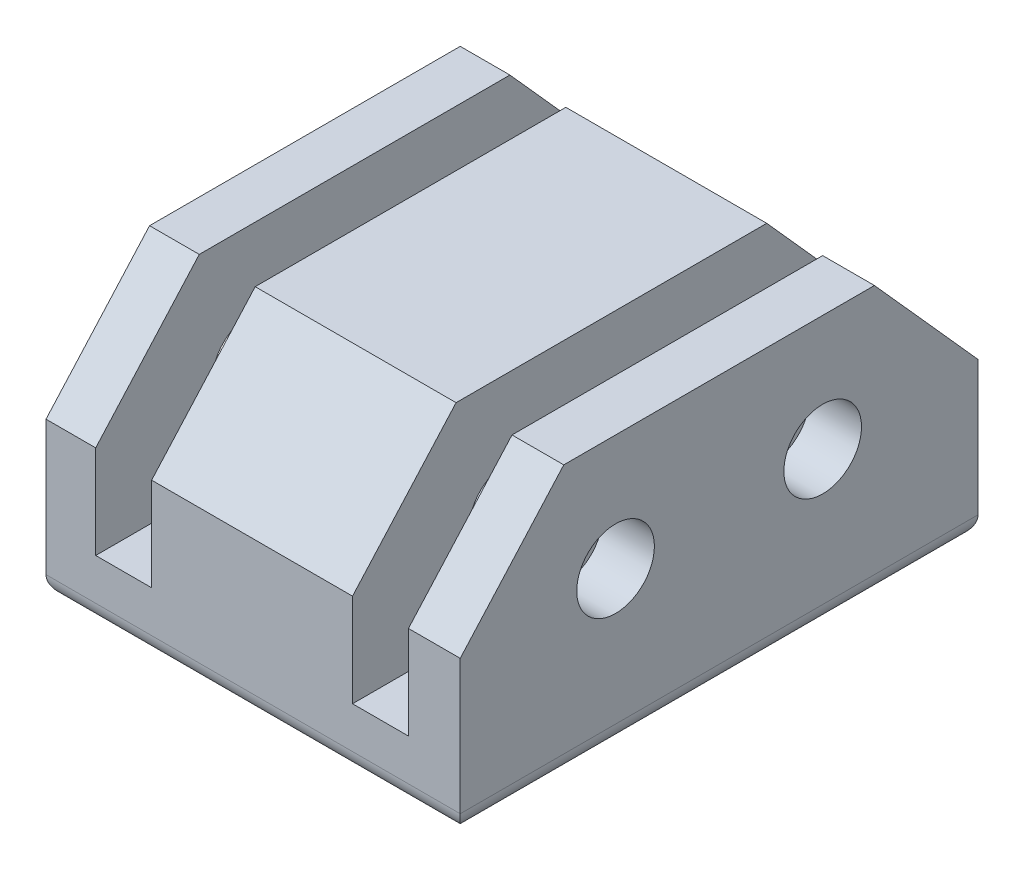
ISO-10303-21;
HEADER;
FILE_DESCRIPTION(('STEP AP214'),'2;1');
FILE_NAME('part.step','',(''),(''),'','','');
FILE_SCHEMA(('AUTOMOTIVE_DESIGN { 1 0 10303 214 1 1 1 1 }'));
ENDSEC;
DATA;
#1=APPLICATION_CONTEXT('core data for automotive mechanical design processes');
#2=APPLICATION_PROTOCOL_DEFINITION('international standard','automotive_design',2000,#1);
#3=PRODUCT_CONTEXT('',#1,'mechanical');
#4=PRODUCT('Part','Part','',(#3));
#5=PRODUCT_RELATED_PRODUCT_CATEGORY('part','',(#4));
#6=PRODUCT_DEFINITION_FORMATION('','',#4);
#7=PRODUCT_DEFINITION_CONTEXT('part definition',#1,'design');
#8=PRODUCT_DEFINITION('design','',#6,#7);
#9=PRODUCT_DEFINITION_SHAPE('','',#8);
#10=(LENGTH_UNIT() NAMED_UNIT(*) SI_UNIT(.MILLI.,.METRE.));
#11=(NAMED_UNIT(*) PLANE_ANGLE_UNIT() SI_UNIT($,.RADIAN.));
#12=(NAMED_UNIT(*) SI_UNIT($,.STERADIAN.) SOLID_ANGLE_UNIT());
#13=UNCERTAINTY_MEASURE_WITH_UNIT(LENGTH_MEASURE(1.E-05),#10,'distance_accuracy_value','');
#14=(GEOMETRIC_REPRESENTATION_CONTEXT(3) GLOBAL_UNCERTAINTY_ASSIGNED_CONTEXT((#13)) GLOBAL_UNIT_ASSIGNED_CONTEXT((#10,
#11,#12)) REPRESENTATION_CONTEXT('',''));
#15=CARTESIAN_POINT('',(0.,0.,0.));
#16=DIRECTION('',(0.,0.,1.));
#17=DIRECTION('',(1.,0.,0.));
#18=AXIS2_PLACEMENT_3D('',#15,#16,#17);
#19=CARTESIAN_POINT('',(-50.8,19.05,0.));
#20=DIRECTION('',(0.,0.666666666666667,0.74535599249993));
#21=DIRECTION('',(0.,-0.74535599249993,0.666666666666667));
#22=AXIS2_PLACEMENT_3D('',#19,#20,#21);
#23=PLANE('',#22);
#24=DIRECTION('',(0.,-0.74535599249993,0.666666666666667));
#25=VECTOR('',#24,1.);
#26=CARTESIAN_POINT('',(-44.704,19.05,0.));
#27=LINE('',#26,#25);
#28=CARTESIAN_POINT('',(-44.704,33.2490316571237,-12.7));
#29=VERTEX_POINT('',#28);
#30=CARTESIAN_POINT('',(-44.704,19.05,0.));
#31=VERTEX_POINT('',#30);
#32=EDGE_CURVE('E222',#29,#31,#27,.T.);
#33=ORIENTED_EDGE('',*,*,#32,.F.);
#34=DIRECTION('',(1.,0.,0.));
#35=VECTOR('',#34,1.);
#36=CARTESIAN_POINT('',(-50.8,33.2490316571237,-12.7));
#37=LINE('',#36,#35);
#38=CARTESIAN_POINT('',(-50.8,33.2490316571237,-12.7));
#39=VERTEX_POINT('',#38);
#40=EDGE_CURVE('E279',#39,#29,#37,.T.);
#41=ORIENTED_EDGE('',*,*,#40,.F.);
#42=DIRECTION('',(0.,-0.74535599249993,0.666666666666667));
#43=VECTOR('',#42,1.);
#44=CARTESIAN_POINT('',(-50.8,19.05,0.));
#45=LINE('',#44,#43);
#46=CARTESIAN_POINT('',(-50.8,19.05,0.));
#47=VERTEX_POINT('',#46);
#48=EDGE_CURVE('E263',#39,#47,#45,.T.);
#49=ORIENTED_EDGE('',*,*,#48,.T.);
#50=DIRECTION('',(1.,0.,0.));
#51=VECTOR('',#50,1.);
#52=CARTESIAN_POINT('',(-50.8,19.05,0.));
#53=LINE('',#52,#51);
#54=EDGE_CURVE('E274',#47,#31,#53,.T.);
#55=ORIENTED_EDGE('',*,*,#54,.T.);
#56=EDGE_LOOP('',(#33,#41,#49,#55));
#57=FACE_BOUND('',#56,.T.);
#58=ADVANCED_FACE('F39',(#57),#23,.T.);
#59=CARTESIAN_POINT('',(-50.8,33.2490316571237,-12.7));
#60=DIRECTION('',(0.,1.,0.));
#61=DIRECTION('',(0.,0.,1.));
#62=AXIS2_PLACEMENT_3D('',#59,#60,#61);
#63=PLANE('',#62);
#64=DIRECTION('',(0.,0.,-1.));
#65=VECTOR('',#64,1.);
#66=CARTESIAN_POINT('',(-44.704,33.2490316571237,0.));
#67=LINE('',#66,#65);
#68=CARTESIAN_POINT('',(-44.704,33.2490316571237,-50.8));
#69=VERTEX_POINT('',#68);
#70=EDGE_CURVE('E196',#29,#69,#67,.T.);
#71=ORIENTED_EDGE('',*,*,#70,.T.);
#72=DIRECTION('',(1.,0.,0.));
#73=VECTOR('',#72,1.);
#74=CARTESIAN_POINT('',(-50.8,33.2490316571237,-50.8));
#75=LINE('',#74,#73);
#76=CARTESIAN_POINT('',(-50.8,33.2490316571237,-50.8));
#77=VERTEX_POINT('',#76);
#78=EDGE_CURVE('E284',#77,#69,#75,.T.);
#79=ORIENTED_EDGE('',*,*,#78,.F.);
#80=DIRECTION('',(0.,0.,1.));
#81=VECTOR('',#80,1.);
#82=CARTESIAN_POINT('',(-50.8,33.2490316571237,-12.7));
#83=LINE('',#82,#81);
#84=EDGE_CURVE('E259',#77,#39,#83,.T.);
#85=ORIENTED_EDGE('',*,*,#84,.T.);
#86=ORIENTED_EDGE('',*,*,#40,.T.);
#87=EDGE_LOOP('',(#71,#79,#85,#86));
#88=FACE_BOUND('',#87,.T.);
#89=ADVANCED_FACE('F396',(#88),#63,.T.);
#90=CARTESIAN_POINT('',(-50.8,33.2490316571237,-50.8));
#91=DIRECTION('',(0.,0.666666666666666,-0.74535599249993));
#92=DIRECTION('',(0.,0.74535599249993,0.666666666666666));
#93=AXIS2_PLACEMENT_3D('',#90,#91,#92);
#94=PLANE('',#93);
#95=DIRECTION('',(0.,0.74535599249993,0.666666666666666));
#96=VECTOR('',#95,1.);
#97=CARTESIAN_POINT('',(-44.704,33.2490316571237,-50.8));
#98=LINE('',#97,#96);
#99=CARTESIAN_POINT('',(-44.704,19.05,-63.5));
#100=VERTEX_POINT('',#99);
#101=EDGE_CURVE('E220',#100,#69,#98,.T.);
#102=ORIENTED_EDGE('',*,*,#101,.F.);
#103=DIRECTION('',(1.,0.,0.));
#104=VECTOR('',#103,1.);
#105=CARTESIAN_POINT('',(-50.8,19.05,-63.5));
#106=LINE('',#105,#104);
#107=CARTESIAN_POINT('',(-50.8,19.05,-63.5));
#108=VERTEX_POINT('',#107);
#109=EDGE_CURVE('E289',#108,#100,#106,.T.);
#110=ORIENTED_EDGE('',*,*,#109,.F.);
#111=DIRECTION('',(0.,0.74535599249993,0.666666666666666));
#112=VECTOR('',#111,1.);
#113=CARTESIAN_POINT('',(-50.8,33.2490316571237,-50.8));
#114=LINE('',#113,#112);
#115=EDGE_CURVE('E256',#108,#77,#114,.T.);
#116=ORIENTED_EDGE('',*,*,#115,.T.);
#117=ORIENTED_EDGE('',*,*,#78,.T.);
#118=EDGE_LOOP('',(#102,#110,#116,#117));
#119=FACE_BOUND('',#118,.T.);
#120=ADVANCED_FACE('F404',(#119),#94,.T.);
#121=DIRECTION('',(0.,0.74535599249993,-0.666666666666667));
#122=VECTOR('',#121,1.);
#123=CARTESIAN_POINT('',(-37.846,19.05,0.));
#124=LINE('',#123,#122);
#125=CARTESIAN_POINT('',(-37.846,19.05,0.));
#126=VERTEX_POINT('',#125);
#127=CARTESIAN_POINT('',(-37.846,33.2490316571237,-12.7));
#128=VERTEX_POINT('',#127);
#129=EDGE_CURVE('E218',#126,#128,#124,.T.);
#130=ORIENTED_EDGE('',*,*,#129,.F.);
#131=CARTESIAN_POINT('',(-13.208,19.05,0.));
#132=VERTEX_POINT('',#131);
#133=EDGE_CURVE('E201',#126,#132,#53,.T.);
#134=ORIENTED_EDGE('',*,*,#133,.T.);
#135=DIRECTION('',(0.,-0.74535599249993,0.666666666666667));
#136=VECTOR('',#135,1.);
#137=CARTESIAN_POINT('',(-13.208,19.05,0.));
#138=LINE('',#137,#136);
#139=CARTESIAN_POINT('',(-13.208,33.2490316571237,-12.7));
#140=VERTEX_POINT('',#139);
#141=EDGE_CURVE('E252',#140,#132,#138,.T.);
#142=ORIENTED_EDGE('',*,*,#141,.F.);
#143=EDGE_CURVE('E282',#128,#140,#37,.T.);
#144=ORIENTED_EDGE('',*,*,#143,.F.);
#145=EDGE_LOOP('',(#130,#134,#142,#144));
#146=FACE_BOUND('',#145,.T.);
#147=ADVANCED_FACE('F399',(#146),#23,.T.);
#148=DIRECTION('',(0.,0.,-1.));
#149=VECTOR('',#148,1.);
#150=CARTESIAN_POINT('',(-37.846,33.2490316571237,0.));
#151=LINE('',#150,#149);
#152=CARTESIAN_POINT('',(-37.846,33.2490316571237,-50.8));
#153=VERTEX_POINT('',#152);
#154=EDGE_CURVE('E188',#128,#153,#151,.T.);
#155=ORIENTED_EDGE('',*,*,#154,.F.);
#156=ORIENTED_EDGE('',*,*,#143,.T.);
#157=DIRECTION('',(0.,0.,-1.));
#158=VECTOR('',#157,1.);
#159=CARTESIAN_POINT('',(-13.208,33.2490316571237,0.));
#160=LINE('',#159,#158);
#161=CARTESIAN_POINT('',(-13.208,33.2490316571237,-50.8));
#162=VERTEX_POINT('',#161);
#163=EDGE_CURVE('E234',#140,#162,#160,.T.);
#164=ORIENTED_EDGE('',*,*,#163,.T.);
#165=EDGE_CURVE('E287',#153,#162,#75,.T.);
#166=ORIENTED_EDGE('',*,*,#165,.F.);
#167=EDGE_LOOP('',(#155,#156,#164,#166));
#168=FACE_BOUND('',#167,.T.);
#169=ADVANCED_FACE('F407',(#168),#63,.T.);
#170=DIRECTION('',(0.,-0.74535599249993,-0.666666666666666));
#171=VECTOR('',#170,1.);
#172=CARTESIAN_POINT('',(-37.846,33.2490316571237,-50.8));
#173=LINE('',#172,#171);
#174=CARTESIAN_POINT('',(-37.846,19.05,-63.5));
#175=VERTEX_POINT('',#174);
#176=EDGE_CURVE('E212',#153,#175,#173,.T.);
#177=ORIENTED_EDGE('',*,*,#176,.F.);
#178=ORIENTED_EDGE('',*,*,#165,.T.);
#179=DIRECTION('',(0.,0.74535599249993,0.666666666666666));
#180=VECTOR('',#179,1.);
#181=CARTESIAN_POINT('',(-13.208,33.2490316571237,-50.8));
#182=LINE('',#181,#180);
#183=CARTESIAN_POINT('',(-13.208,19.05,-63.5));
#184=VERTEX_POINT('',#183);
#185=EDGE_CURVE('E303',#184,#162,#182,.T.);
#186=ORIENTED_EDGE('',*,*,#185,.F.);
#187=EDGE_CURVE('E292',#175,#184,#106,.T.);
#188=ORIENTED_EDGE('',*,*,#187,.F.);
#189=EDGE_LOOP('',(#177,#178,#186,#188));
#190=FACE_BOUND('',#189,.T.);
#191=ADVANCED_FACE('F446',(#190),#94,.T.);
#192=CARTESIAN_POINT('',(-50.8,0.,0.));
#193=DIRECTION('',(0.,0.,1.));
#194=DIRECTION('',(1.,0.,0.));
#195=AXIS2_PLACEMENT_3D('',#192,#193,#194);
#196=PLANE('',#195);
#197=DIRECTION('',(0.,-1.,0.));
#198=VECTOR('',#197,1.);
#199=CARTESIAN_POINT('',(-50.8,0.,0.));
#200=LINE('',#199,#198);
#201=CARTESIAN_POINT('',(-50.8,2.54,0.));
#202=VERTEX_POINT('',#201);
#203=EDGE_CURVE('E293',#47,#202,#200,.T.);
#204=ORIENTED_EDGE('',*,*,#203,.T.);
#205=DIRECTION('',(1.,0.,0.));
#206=VECTOR('',#205,1.);
#207=CARTESIAN_POINT('',(-50.8,2.54,0.));
#208=LINE('',#207,#206);
#209=CARTESIAN_POINT('',(0.,2.54,0.));
#210=VERTEX_POINT('',#209);
#211=EDGE_CURVE('E11',#202,#210,#208,.T.);
#212=ORIENTED_EDGE('',*,*,#211,.T.);
#213=DIRECTION('',(0.,-1.,0.));
#214=VECTOR('',#213,1.);
#215=CARTESIAN_POINT('',(0.,0.,0.));
#216=LINE('',#215,#214);
#217=CARTESIAN_POINT('',(0.,19.05,0.));
#218=VERTEX_POINT('',#217);
#219=EDGE_CURVE('E277',#218,#210,#216,.T.);
#220=ORIENTED_EDGE('',*,*,#219,.F.);
#221=CARTESIAN_POINT('',(-6.35,19.05,0.));
#222=VERTEX_POINT('',#221);
#223=EDGE_CURVE('E278',#222,#218,#53,.T.);
#224=ORIENTED_EDGE('',*,*,#223,.F.);
#225=DIRECTION('',(0.,-1.,0.));
#226=VECTOR('',#225,1.);
#227=CARTESIAN_POINT('',(-6.35,7.62,0.));
#228=LINE('',#227,#226);
#229=CARTESIAN_POINT('',(-6.35,7.62,0.));
#230=VERTEX_POINT('',#229);
#231=EDGE_CURVE('E227',#222,#230,#228,.T.);
#232=ORIENTED_EDGE('',*,*,#231,.T.);
#233=DIRECTION('',(-1.,0.,0.));
#234=VECTOR('',#233,1.);
#235=CARTESIAN_POINT('',(-6.35,7.62,0.));
#236=LINE('',#235,#234);
#237=CARTESIAN_POINT('',(-13.208,7.62,0.));
#238=VERTEX_POINT('',#237);
#239=EDGE_CURVE('E231',#230,#238,#236,.T.);
#240=ORIENTED_EDGE('',*,*,#239,.T.);
#241=DIRECTION('',(0.,1.,0.));
#242=VECTOR('',#241,1.);
#243=CARTESIAN_POINT('',(-13.208,7.62,0.));
#244=LINE('',#243,#242);
#245=EDGE_CURVE('E225',#238,#132,#244,.T.);
#246=ORIENTED_EDGE('',*,*,#245,.T.);
#247=ORIENTED_EDGE('',*,*,#133,.F.);
#248=DIRECTION('',(0.,-1.,0.));
#249=VECTOR('',#248,1.);
#250=CARTESIAN_POINT('',(-37.846,7.62,0.));
#251=LINE('',#250,#249);
#252=CARTESIAN_POINT('',(-37.846,7.62,0.));
#253=VERTEX_POINT('',#252);
#254=EDGE_CURVE('E180',#126,#253,#251,.T.);
#255=ORIENTED_EDGE('',*,*,#254,.T.);
#256=DIRECTION('',(-1.,0.,0.));
#257=VECTOR('',#256,1.);
#258=CARTESIAN_POINT('',(-37.846,7.62,0.));
#259=LINE('',#258,#257);
#260=CARTESIAN_POINT('',(-44.704,7.62,0.));
#261=VERTEX_POINT('',#260);
#262=EDGE_CURVE('E191',#253,#261,#259,.T.);
#263=ORIENTED_EDGE('',*,*,#262,.T.);
#264=DIRECTION('',(0.,1.,0.));
#265=VECTOR('',#264,1.);
#266=CARTESIAN_POINT('',(-44.704,7.62,0.));
#267=LINE('',#266,#265);
#268=EDGE_CURVE('E202',#261,#31,#267,.T.);
#269=ORIENTED_EDGE('',*,*,#268,.T.);
#270=ORIENTED_EDGE('',*,*,#54,.F.);
#271=EDGE_LOOP('',(#204,#212,#220,#224,#232,#240,#246,#247,#255,#263,#269,#270));
#272=FACE_BOUND('',#271,.T.);
#273=ADVANCED_FACE('F199',(#272),#196,.T.);
#274=CARTESIAN_POINT('',(-50.8,0.,-63.5));
#275=DIRECTION('',(0.,0.,-1.));
#276=DIRECTION('',(-1.,0.,0.));
#277=AXIS2_PLACEMENT_3D('',#274,#275,#276);
#278=PLANE('',#277);
#279=DIRECTION('',(0.,1.,0.));
#280=VECTOR('',#279,1.);
#281=CARTESIAN_POINT('',(0.,0.,-63.5));
#282=LINE('',#281,#280);
#283=CARTESIAN_POINT('',(0.,2.54,-63.5));
#284=VERTEX_POINT('',#283);
#285=CARTESIAN_POINT('',(0.,19.05,-63.5));
#286=VERTEX_POINT('',#285);
#287=EDGE_CURVE('E296',#284,#286,#282,.T.);
#288=ORIENTED_EDGE('',*,*,#287,.F.);
#289=DIRECTION('',(1.,0.,0.));
#290=VECTOR('',#289,1.);
#291=CARTESIAN_POINT('',(-50.8,2.54,-63.5));
#292=LINE('',#291,#290);
#293=CARTESIAN_POINT('',(-50.8,2.54,-63.5));
#294=VERTEX_POINT('',#293);
#295=EDGE_CURVE('E63',#284,#294,#292,.F.);
#296=ORIENTED_EDGE('',*,*,#295,.T.);
#297=DIRECTION('',(0.,1.,0.));
#298=VECTOR('',#297,1.);
#299=CARTESIAN_POINT('',(-50.8,0.,-63.5));
#300=LINE('',#299,#298);
#301=EDGE_CURVE('E295',#294,#108,#300,.T.);
#302=ORIENTED_EDGE('',*,*,#301,.T.);
#303=ORIENTED_EDGE('',*,*,#109,.T.);
#304=DIRECTION('',(0.,1.,0.));
#305=VECTOR('',#304,1.);
#306=CARTESIAN_POINT('',(-44.704,7.62,-63.5));
#307=LINE('',#306,#305);
#308=CARTESIAN_POINT('',(-44.704,7.62,-63.5));
#309=VERTEX_POINT('',#308);
#310=EDGE_CURVE('E208',#309,#100,#307,.T.);
#311=ORIENTED_EDGE('',*,*,#310,.F.);
#312=DIRECTION('',(-1.,0.,0.));
#313=VECTOR('',#312,1.);
#314=CARTESIAN_POINT('',(-37.846,7.62,-63.5));
#315=LINE('',#314,#313);
#316=CARTESIAN_POINT('',(-37.846,7.62,-63.5));
#317=VERTEX_POINT('',#316);
#318=EDGE_CURVE('E204',#317,#309,#315,.T.);
#319=ORIENTED_EDGE('',*,*,#318,.F.);
#320=DIRECTION('',(0.,-1.,0.));
#321=VECTOR('',#320,1.);
#322=CARTESIAN_POINT('',(-37.846,0.,-63.5));
#323=LINE('',#322,#321);
#324=EDGE_CURVE('E183',#175,#317,#323,.T.);
#325=ORIENTED_EDGE('',*,*,#324,.F.);
#326=ORIENTED_EDGE('',*,*,#187,.T.);
#327=DIRECTION('',(0.,1.,0.));
#328=VECTOR('',#327,1.);
#329=CARTESIAN_POINT('',(-13.208,7.62,-63.5));
#330=LINE('',#329,#328);
#331=CARTESIAN_POINT('',(-13.208,7.62,-63.5));
#332=VERTEX_POINT('',#331);
#333=EDGE_CURVE('E224',#332,#184,#330,.T.);
#334=ORIENTED_EDGE('',*,*,#333,.F.);
#335=DIRECTION('',(-1.,0.,0.));
#336=VECTOR('',#335,1.);
#337=CARTESIAN_POINT('',(-6.35,7.62,-63.5));
#338=LINE('',#337,#336);
#339=CARTESIAN_POINT('',(-6.35,7.62,-63.5));
#340=VERTEX_POINT('',#339);
#341=EDGE_CURVE('E228',#340,#332,#338,.T.);
#342=ORIENTED_EDGE('',*,*,#341,.F.);
#343=DIRECTION('',(0.,-1.,0.));
#344=VECTOR('',#343,1.);
#345=CARTESIAN_POINT('',(-6.35,7.62,-63.5));
#346=LINE('',#345,#344);
#347=CARTESIAN_POINT('',(-6.35,19.05,-63.5));
#348=VERTEX_POINT('',#347);
#349=EDGE_CURVE('E237',#348,#340,#346,.T.);
#350=ORIENTED_EDGE('',*,*,#349,.F.);
#351=EDGE_CURVE('E266',#348,#286,#106,.T.);
#352=ORIENTED_EDGE('',*,*,#351,.T.);
#353=EDGE_LOOP('',(#288,#296,#302,#303,#311,#319,#325,#326,#334,#342,#350,#352));
#354=FACE_BOUND('',#353,.T.);
#355=ADVANCED_FACE('F460',(#354),#278,.T.);
#356=CARTESIAN_POINT('',(-50.8,0.,0.));
#357=DIRECTION('',(0.,-1.,0.));
#358=DIRECTION('',(0.,0.,-1.));
#359=AXIS2_PLACEMENT_3D('',#356,#357,#358);
#360=PLANE('',#359);
#361=CARTESIAN_POINT('',(-9.52499999999999,0.,-12.7));
#362=DIRECTION('',(0.,-1.,0.));
#363=DIRECTION('',(0.,0.,-1.));
#364=AXIS2_PLACEMENT_3D('',#361,#362,#363);
#365=CIRCLE('',#364,1.778);
#366=CARTESIAN_POINT('',(-9.52499999999999,0.,-14.478));
#367=VERTEX_POINT('',#366);
#368=EDGE_CURVE('E725',#367,#367,#365,.T.);
#369=ORIENTED_EDGE('',*,*,#368,.F.);
#370=EDGE_LOOP('',(#369));
#371=FACE_BOUND('',#370,.T.);
#372=CARTESIAN_POINT('',(-41.275,0.,-12.7));
#373=DIRECTION('',(0.,-1.,0.));
#374=DIRECTION('',(0.,0.,-1.));
#375=AXIS2_PLACEMENT_3D('',#372,#373,#374);
#376=CIRCLE('',#375,1.778);
#377=CARTESIAN_POINT('',(-41.275,0.,-14.478));
#378=VERTEX_POINT('',#377);
#379=EDGE_CURVE('E727',#378,#378,#376,.T.);
#380=ORIENTED_EDGE('',*,*,#379,.F.);
#381=EDGE_LOOP('',(#380));
#382=FACE_BOUND('',#381,.T.);
#383=CARTESIAN_POINT('',(-41.275,0.,-50.8));
#384=DIRECTION('',(0.,-1.,0.));
#385=DIRECTION('',(0.,0.,-1.));
#386=AXIS2_PLACEMENT_3D('',#383,#384,#385);
#387=CIRCLE('',#386,1.778);
#388=CARTESIAN_POINT('',(-41.275,0.,-52.578));
#389=VERTEX_POINT('',#388);
#390=EDGE_CURVE('E763',#389,#389,#387,.T.);
#391=ORIENTED_EDGE('',*,*,#390,.F.);
#392=EDGE_LOOP('',(#391));
#393=FACE_BOUND('',#392,.T.);
#394=CARTESIAN_POINT('',(-9.52499999999999,0.,-50.8));
#395=DIRECTION('',(0.,-1.,0.));
#396=DIRECTION('',(0.,0.,-1.));
#397=AXIS2_PLACEMENT_3D('',#394,#395,#396);
#398=CIRCLE('',#397,1.778);
#399=CARTESIAN_POINT('',(-9.52499999999999,0.,-52.578));
#400=VERTEX_POINT('',#399);
#401=EDGE_CURVE('E733',#400,#400,#398,.T.);
#402=ORIENTED_EDGE('',*,*,#401,.F.);
#403=EDGE_LOOP('',(#402));
#404=FACE_BOUND('',#403,.T.);
#405=DIRECTION('',(1.,0.,0.));
#406=VECTOR('',#405,1.);
#407=CARTESIAN_POINT('',(-50.8,0.,-60.96));
#408=LINE('',#407,#406);
#409=CARTESIAN_POINT('',(-48.26,0.,-60.96));
#410=VERTEX_POINT('',#409);
#411=CARTESIAN_POINT('',(-2.54,0.,-60.96));
#412=VERTEX_POINT('',#411);
#413=EDGE_CURVE('E324',#410,#412,#408,.T.);
#414=ORIENTED_EDGE('',*,*,#413,.T.);
#415=DIRECTION('',(0.,0.,-1.));
#416=VECTOR('',#415,1.);
#417=CARTESIAN_POINT('',(-2.54,0.,0.));
#418=LINE('',#417,#416);
#419=CARTESIAN_POINT('',(-2.54,0.,-2.54));
#420=VERTEX_POINT('',#419);
#421=EDGE_CURVE('E326',#412,#420,#418,.F.);
#422=ORIENTED_EDGE('',*,*,#421,.T.);
#423=DIRECTION('',(1.,0.,0.));
#424=VECTOR('',#423,1.);
#425=CARTESIAN_POINT('',(-50.8,0.,-2.54));
#426=LINE('',#425,#424);
#427=CARTESIAN_POINT('',(-48.26,0.,-2.54));
#428=VERTEX_POINT('',#427);
#429=EDGE_CURVE('E320',#420,#428,#426,.F.);
#430=ORIENTED_EDGE('',*,*,#429,.T.);
#431=DIRECTION('',(0.,0.,-1.));
#432=VECTOR('',#431,1.);
#433=CARTESIAN_POINT('',(-48.26,0.,0.));
#434=LINE('',#433,#432);
#435=EDGE_CURVE('E322',#428,#410,#434,.T.);
#436=ORIENTED_EDGE('',*,*,#435,.T.);
#437=EDGE_LOOP('',(#414,#422,#430,#436));
#438=FACE_BOUND('',#437,.T.);
#439=ADVANCED_FACE('F491',(#371,#382,#393,#404,#438),#360,.T.);
#440=CARTESIAN_POINT('',(-50.8,0.,0.));
#441=DIRECTION('',(-1.,0.,0.));
#442=DIRECTION('',(0.,0.,1.));
#443=AXIS2_PLACEMENT_3D('',#440,#441,#442);
#444=PLANE('',#443);
#445=CARTESIAN_POINT('',(-50.8,19.05,-19.05));
#446=DIRECTION('',(1.,0.,0.));
#447=DIRECTION('',(0.,0.,-1.));
#448=AXIS2_PLACEMENT_3D('',#445,#446,#447);
#449=CIRCLE('',#448,4.7625);
#450=CARTESIAN_POINT('',(-50.8,19.05,-23.8125));
#451=VERTEX_POINT('',#450);
#452=EDGE_CURVE('E312',#451,#451,#449,.T.);
#453=ORIENTED_EDGE('',*,*,#452,.T.);
#454=EDGE_LOOP('',(#453));
#455=FACE_BOUND('',#454,.T.);
#456=CARTESIAN_POINT('',(-50.8,19.05,-44.45));
#457=DIRECTION('',(1.,0.,0.));
#458=DIRECTION('',(0.,0.,-1.));
#459=AXIS2_PLACEMENT_3D('',#456,#457,#458);
#460=CIRCLE('',#459,4.7625);
#461=CARTESIAN_POINT('',(-50.8,19.05,-49.2125));
#462=VERTEX_POINT('',#461);
#463=EDGE_CURVE('E347',#462,#462,#460,.T.);
#464=ORIENTED_EDGE('',*,*,#463,.T.);
#465=EDGE_LOOP('',(#464));
#466=FACE_BOUND('',#465,.T.);
#467=ORIENTED_EDGE('',*,*,#301,.F.);
#468=DIRECTION('',(0.,0.,-1.));
#469=VECTOR('',#468,1.);
#470=CARTESIAN_POINT('',(-50.8,2.54,0.));
#471=LINE('',#470,#469);
#472=EDGE_CURVE('E48',#294,#202,#471,.F.);
#473=ORIENTED_EDGE('',*,*,#472,.T.);
#474=ORIENTED_EDGE('',*,*,#203,.F.);
#475=ORIENTED_EDGE('',*,*,#48,.F.);
#476=ORIENTED_EDGE('',*,*,#84,.F.);
#477=ORIENTED_EDGE('',*,*,#115,.F.);
#478=EDGE_LOOP('',(#467,#473,#474,#475,#476,#477));
#479=FACE_BOUND('',#478,.T.);
#480=ADVANCED_FACE('F422',(#455,#466,#479),#444,.T.);
#481=CARTESIAN_POINT('',(0.,0.,0.));
#482=DIRECTION('',(-1.,0.,0.));
#483=DIRECTION('',(0.,0.,1.));
#484=AXIS2_PLACEMENT_3D('',#481,#482,#483);
#485=PLANE('',#484);
#486=CARTESIAN_POINT('',(0.,19.05,-19.05));
#487=DIRECTION('',(1.,0.,0.));
#488=DIRECTION('',(0.,0.,-1.));
#489=AXIS2_PLACEMENT_3D('',#486,#487,#488);
#490=CIRCLE('',#489,4.7625);
#491=CARTESIAN_POINT('',(0.,19.05,-23.8125));
#492=VERTEX_POINT('',#491);
#493=EDGE_CURVE('E352',#492,#492,#490,.T.);
#494=ORIENTED_EDGE('',*,*,#493,.F.);
#495=EDGE_LOOP('',(#494));
#496=FACE_BOUND('',#495,.T.);
#497=CARTESIAN_POINT('',(0.,19.05,-44.45));
#498=DIRECTION('',(1.,0.,0.));
#499=DIRECTION('',(0.,0.,-1.));
#500=AXIS2_PLACEMENT_3D('',#497,#498,#499);
#501=CIRCLE('',#500,4.7625);
#502=CARTESIAN_POINT('',(0.,19.05,-49.2125));
#503=VERTEX_POINT('',#502);
#504=EDGE_CURVE('E341',#503,#503,#501,.T.);
#505=ORIENTED_EDGE('',*,*,#504,.F.);
#506=EDGE_LOOP('',(#505));
#507=FACE_BOUND('',#506,.T.);
#508=ORIENTED_EDGE('',*,*,#219,.T.);
#509=DIRECTION('',(0.,0.,-1.));
#510=VECTOR('',#509,1.);
#511=CARTESIAN_POINT('',(0.,2.54,-63.5));
#512=LINE('',#511,#510);
#513=EDGE_CURVE('E307',#210,#284,#512,.T.);
#514=ORIENTED_EDGE('',*,*,#513,.T.);
#515=ORIENTED_EDGE('',*,*,#287,.T.);
#516=DIRECTION('',(0.,0.74535599249993,0.666666666666666));
#517=VECTOR('',#516,1.);
#518=CARTESIAN_POINT('',(0.,33.2490316571237,-50.8));
#519=LINE('',#518,#517);
#520=CARTESIAN_POINT('',(0.,33.2490316571237,-50.8));
#521=VERTEX_POINT('',#520);
#522=EDGE_CURVE('E255',#286,#521,#519,.T.);
#523=ORIENTED_EDGE('',*,*,#522,.T.);
#524=DIRECTION('',(0.,0.,1.));
#525=VECTOR('',#524,1.);
#526=CARTESIAN_POINT('',(0.,33.2490316571237,-12.7));
#527=LINE('',#526,#525);
#528=CARTESIAN_POINT('',(0.,33.2490316571237,-12.7));
#529=VERTEX_POINT('',#528);
#530=EDGE_CURVE('E269',#521,#529,#527,.T.);
#531=ORIENTED_EDGE('',*,*,#530,.T.);
#532=DIRECTION('',(0.,-0.74535599249993,0.666666666666667));
#533=VECTOR('',#532,1.);
#534=CARTESIAN_POINT('',(0.,19.05,0.));
#535=LINE('',#534,#533);
#536=EDGE_CURVE('E260',#529,#218,#535,.T.);
#537=ORIENTED_EDGE('',*,*,#536,.T.);
#538=EDGE_LOOP('',(#508,#514,#515,#523,#531,#537));
#539=FACE_BOUND('',#538,.T.);
#540=ADVANCED_FACE('F414',(#496,#507,#539),#485,.F.);
#541=DIRECTION('',(0.,0.74535599249993,-0.666666666666667));
#542=VECTOR('',#541,1.);
#543=CARTESIAN_POINT('',(-6.35,19.05,0.));
#544=LINE('',#543,#542);
#545=CARTESIAN_POINT('',(-6.35,33.2490316571237,-12.7));
#546=VERTEX_POINT('',#545);
#547=EDGE_CURVE('E243',#222,#546,#544,.T.);
#548=ORIENTED_EDGE('',*,*,#547,.F.);
#549=ORIENTED_EDGE('',*,*,#223,.T.);
#550=ORIENTED_EDGE('',*,*,#536,.F.);
#551=EDGE_CURVE('E283',#546,#529,#37,.T.);
#552=ORIENTED_EDGE('',*,*,#551,.F.);
#553=EDGE_LOOP('',(#548,#549,#550,#552));
#554=FACE_BOUND('',#553,.T.);
#555=ADVANCED_FACE('F400',(#554),#23,.T.);
#556=DIRECTION('',(0.,0.,-1.));
#557=VECTOR('',#556,1.);
#558=CARTESIAN_POINT('',(-6.35,33.2490316571237,0.));
#559=LINE('',#558,#557);
#560=CARTESIAN_POINT('',(-6.35,33.2490316571237,-50.8));
#561=VERTEX_POINT('',#560);
#562=EDGE_CURVE('E247',#546,#561,#559,.T.);
#563=ORIENTED_EDGE('',*,*,#562,.F.);
#564=ORIENTED_EDGE('',*,*,#551,.T.);
#565=ORIENTED_EDGE('',*,*,#530,.F.);
#566=EDGE_CURVE('E288',#561,#521,#75,.T.);
#567=ORIENTED_EDGE('',*,*,#566,.F.);
#568=EDGE_LOOP('',(#563,#564,#565,#567));
#569=FACE_BOUND('',#568,.T.);
#570=ADVANCED_FACE('F408',(#569),#63,.T.);
#571=DIRECTION('',(0.,-0.74535599249993,-0.666666666666666));
#572=VECTOR('',#571,1.);
#573=CARTESIAN_POINT('',(-6.35,33.2490316571237,-50.8));
#574=LINE('',#573,#572);
#575=EDGE_CURVE('E298',#561,#348,#574,.T.);
#576=ORIENTED_EDGE('',*,*,#575,.F.);
#577=ORIENTED_EDGE('',*,*,#566,.T.);
#578=ORIENTED_EDGE('',*,*,#522,.F.);
#579=ORIENTED_EDGE('',*,*,#351,.F.);
#580=EDGE_LOOP('',(#576,#577,#578,#579));
#581=FACE_BOUND('',#580,.T.);
#582=ADVANCED_FACE('F420',(#581),#94,.T.);
#583=CARTESIAN_POINT('',(-13.208,7.62,0.));
#584=DIRECTION('',(-1.,0.,0.));
#585=DIRECTION('',(0.,-1.,0.));
#586=AXIS2_PLACEMENT_3D('',#583,#584,#585);
#587=PLANE('',#586);
#588=CARTESIAN_POINT('',(-13.208,19.05,-19.05));
#589=DIRECTION('',(-1.,0.,0.));
#590=DIRECTION('',(0.,-1.,0.));
#591=AXIS2_PLACEMENT_3D('',#588,#589,#590);
#592=CIRCLE('',#591,4.7625);
#593=CARTESIAN_POINT('',(-13.208,14.2875,-19.05));
#594=VERTEX_POINT('',#593);
#595=EDGE_CURVE('E210',#594,#594,#592,.T.);
#596=ORIENTED_EDGE('',*,*,#595,.T.);
#597=EDGE_LOOP('',(#596));
#598=FACE_BOUND('',#597,.T.);
#599=CARTESIAN_POINT('',(-13.208,19.05,-44.45));
#600=DIRECTION('',(-1.,0.,0.));
#601=DIRECTION('',(0.,-1.,0.));
#602=AXIS2_PLACEMENT_3D('',#599,#600,#601);
#603=CIRCLE('',#602,4.7625);
#604=CARTESIAN_POINT('',(-13.208,14.2875,-44.45));
#605=VERTEX_POINT('',#604);
#606=EDGE_CURVE('E317',#605,#605,#603,.T.);
#607=ORIENTED_EDGE('',*,*,#606,.T.);
#608=EDGE_LOOP('',(#607));
#609=FACE_BOUND('',#608,.T.);
#610=ORIENTED_EDGE('',*,*,#141,.T.);
#611=ORIENTED_EDGE('',*,*,#245,.F.);
#612=DIRECTION('',(0.,0.,-1.));
#613=VECTOR('',#612,1.);
#614=CARTESIAN_POINT('',(-13.208,7.62,0.));
#615=LINE('',#614,#613);
#616=EDGE_CURVE('E241',#238,#332,#615,.T.);
#617=ORIENTED_EDGE('',*,*,#616,.T.);
#618=ORIENTED_EDGE('',*,*,#333,.T.);
#619=ORIENTED_EDGE('',*,*,#185,.T.);
#620=ORIENTED_EDGE('',*,*,#163,.F.);
#621=EDGE_LOOP('',(#610,#611,#617,#618,#619,#620));
#622=FACE_BOUND('',#621,.T.);
#623=ADVANCED_FACE('F370',(#598,#609,#622),#587,.F.);
#624=CARTESIAN_POINT('',(-6.35,7.62,0.));
#625=DIRECTION('',(0.,-1.,0.));
#626=DIRECTION('',(0.,0.,-1.));
#627=AXIS2_PLACEMENT_3D('',#624,#625,#626);
#628=PLANE('',#627);
#629=CARTESIAN_POINT('',(-9.52499999999999,7.62,-12.7));
#630=DIRECTION('',(0.,-1.,0.));
#631=DIRECTION('',(0.,0.,-1.));
#632=AXIS2_PLACEMENT_3D('',#629,#630,#631);
#633=CIRCLE('',#632,1.778);
#634=CARTESIAN_POINT('',(-9.52499999999999,7.62,-14.478));
#635=VERTEX_POINT('',#634);
#636=EDGE_CURVE('E722',#635,#635,#633,.F.);
#637=ORIENTED_EDGE('',*,*,#636,.F.);
#638=EDGE_LOOP('',(#637));
#639=FACE_BOUND('',#638,.T.);
#640=CARTESIAN_POINT('',(-9.52499999999999,7.62,-50.8));
#641=DIRECTION('',(0.,-1.,0.));
#642=DIRECTION('',(0.,0.,-1.));
#643=AXIS2_PLACEMENT_3D('',#640,#641,#642);
#644=CIRCLE('',#643,1.778);
#645=CARTESIAN_POINT('',(-9.52499999999999,7.62,-52.578));
#646=VERTEX_POINT('',#645);
#647=EDGE_CURVE('E334',#646,#646,#644,.F.);
#648=ORIENTED_EDGE('',*,*,#647,.F.);
#649=EDGE_LOOP('',(#648));
#650=FACE_BOUND('',#649,.T.);
#651=ORIENTED_EDGE('',*,*,#341,.T.);
#652=ORIENTED_EDGE('',*,*,#616,.F.);
#653=ORIENTED_EDGE('',*,*,#239,.F.);
#654=DIRECTION('',(0.,0.,-1.));
#655=VECTOR('',#654,1.);
#656=CARTESIAN_POINT('',(-6.35,7.62,0.));
#657=LINE('',#656,#655);
#658=EDGE_CURVE('E244',#230,#340,#657,.T.);
#659=ORIENTED_EDGE('',*,*,#658,.T.);
#660=EDGE_LOOP('',(#651,#652,#653,#659));
#661=FACE_BOUND('',#660,.T.);
#662=ADVANCED_FACE('F439',(#639,#650,#661),#628,.F.);
#663=CARTESIAN_POINT('',(-6.35,7.62,0.));
#664=DIRECTION('',(1.,0.,0.));
#665=DIRECTION('',(0.,0.,-1.));
#666=AXIS2_PLACEMENT_3D('',#663,#664,#665);
#667=PLANE('',#666);
#668=CARTESIAN_POINT('',(-6.35,19.05,-19.05));
#669=DIRECTION('',(1.,0.,0.));
#670=DIRECTION('',(0.,0.,-1.));
#671=AXIS2_PLACEMENT_3D('',#668,#669,#670);
#672=CIRCLE('',#671,4.7625);
#673=CARTESIAN_POINT('',(-6.35,19.05,-23.8125));
#674=VERTEX_POINT('',#673);
#675=EDGE_CURVE('E365',#674,#674,#672,.T.);
#676=ORIENTED_EDGE('',*,*,#675,.T.);
#677=EDGE_LOOP('',(#676));
#678=FACE_BOUND('',#677,.T.);
#679=CARTESIAN_POINT('',(-6.35,19.05,-44.45));
#680=DIRECTION('',(1.,0.,0.));
#681=DIRECTION('',(0.,0.,-1.));
#682=AXIS2_PLACEMENT_3D('',#679,#680,#681);
#683=CIRCLE('',#682,4.7625);
#684=CARTESIAN_POINT('',(-6.35,19.05,-49.2125));
#685=VERTEX_POINT('',#684);
#686=EDGE_CURVE('E358',#685,#685,#683,.T.);
#687=ORIENTED_EDGE('',*,*,#686,.T.);
#688=EDGE_LOOP('',(#687));
#689=FACE_BOUND('',#688,.T.);
#690=ORIENTED_EDGE('',*,*,#547,.T.);
#691=ORIENTED_EDGE('',*,*,#562,.T.);
#692=ORIENTED_EDGE('',*,*,#575,.T.);
#693=ORIENTED_EDGE('',*,*,#349,.T.);
#694=ORIENTED_EDGE('',*,*,#658,.F.);
#695=ORIENTED_EDGE('',*,*,#231,.F.);
#696=EDGE_LOOP('',(#690,#691,#692,#693,#694,#695));
#697=FACE_BOUND('',#696,.T.);
#698=ADVANCED_FACE('F634',(#678,#689,#697),#667,.F.);
#699=CARTESIAN_POINT('',(-44.704,7.62,0.));
#700=DIRECTION('',(-1.,0.,0.));
#701=DIRECTION('',(0.,-1.,0.));
#702=AXIS2_PLACEMENT_3D('',#699,#700,#701);
#703=PLANE('',#702);
#704=CARTESIAN_POINT('',(-44.704,19.05,-19.05));
#705=DIRECTION('',(-1.,0.,0.));
#706=DIRECTION('',(0.,-1.,0.));
#707=AXIS2_PLACEMENT_3D('',#704,#705,#706);
#708=CIRCLE('',#707,4.7625);
#709=CARTESIAN_POINT('',(-44.704,14.2875,-19.05));
#710=VERTEX_POINT('',#709);
#711=EDGE_CURVE('E316',#710,#710,#708,.T.);
#712=ORIENTED_EDGE('',*,*,#711,.T.);
#713=EDGE_LOOP('',(#712));
#714=FACE_BOUND('',#713,.T.);
#715=CARTESIAN_POINT('',(-44.704,19.05,-44.45));
#716=DIRECTION('',(-1.,0.,0.));
#717=DIRECTION('',(0.,-1.,0.));
#718=AXIS2_PLACEMENT_3D('',#715,#716,#717);
#719=CIRCLE('',#718,4.7625);
#720=CARTESIAN_POINT('',(-44.704,14.2875,-44.45));
#721=VERTEX_POINT('',#720);
#722=EDGE_CURVE('E311',#721,#721,#719,.T.);
#723=ORIENTED_EDGE('',*,*,#722,.T.);
#724=EDGE_LOOP('',(#723));
#725=FACE_BOUND('',#724,.T.);
#726=ORIENTED_EDGE('',*,*,#32,.T.);
#727=ORIENTED_EDGE('',*,*,#268,.F.);
#728=DIRECTION('',(0.,0.,-1.));
#729=VECTOR('',#728,1.);
#730=CARTESIAN_POINT('',(-44.704,7.62,0.));
#731=LINE('',#730,#729);
#732=EDGE_CURVE('E187',#261,#309,#731,.T.);
#733=ORIENTED_EDGE('',*,*,#732,.T.);
#734=ORIENTED_EDGE('',*,*,#310,.T.);
#735=ORIENTED_EDGE('',*,*,#101,.T.);
#736=ORIENTED_EDGE('',*,*,#70,.F.);
#737=EDGE_LOOP('',(#726,#727,#733,#734,#735,#736));
#738=FACE_BOUND('',#737,.T.);
#739=ADVANCED_FACE('F465',(#714,#725,#738),#703,.F.);
#740=CARTESIAN_POINT('',(-37.846,7.62,0.));
#741=DIRECTION('',(0.,-1.,0.));
#742=DIRECTION('',(0.,0.,-1.));
#743=AXIS2_PLACEMENT_3D('',#740,#741,#742);
#744=PLANE('',#743);
#745=CARTESIAN_POINT('',(-41.275,7.62,-12.7));
#746=DIRECTION('',(0.,-1.,0.));
#747=DIRECTION('',(0.,0.,-1.));
#748=AXIS2_PLACEMENT_3D('',#745,#746,#747);
#749=CIRCLE('',#748,1.778);
#750=CARTESIAN_POINT('',(-41.275,7.62,-14.478));
#751=VERTEX_POINT('',#750);
#752=EDGE_CURVE('E730',#751,#751,#749,.F.);
#753=ORIENTED_EDGE('',*,*,#752,.F.);
#754=EDGE_LOOP('',(#753));
#755=FACE_BOUND('',#754,.T.);
#756=CARTESIAN_POINT('',(-41.275,7.62,-50.8));
#757=DIRECTION('',(0.,-1.,0.));
#758=DIRECTION('',(0.,0.,-1.));
#759=AXIS2_PLACEMENT_3D('',#756,#757,#758);
#760=CIRCLE('',#759,1.778);
#761=CARTESIAN_POINT('',(-41.275,7.62,-52.578));
#762=VERTEX_POINT('',#761);
#763=EDGE_CURVE('E736',#762,#762,#760,.F.);
#764=ORIENTED_EDGE('',*,*,#763,.F.);
#765=EDGE_LOOP('',(#764));
#766=FACE_BOUND('',#765,.T.);
#767=ORIENTED_EDGE('',*,*,#318,.T.);
#768=ORIENTED_EDGE('',*,*,#732,.F.);
#769=ORIENTED_EDGE('',*,*,#262,.F.);
#770=DIRECTION('',(0.,0.,-1.));
#771=VECTOR('',#770,1.);
#772=CARTESIAN_POINT('',(-37.846,7.62,0.));
#773=LINE('',#772,#771);
#774=EDGE_CURVE('E176',#253,#317,#773,.T.);
#775=ORIENTED_EDGE('',*,*,#774,.T.);
#776=EDGE_LOOP('',(#767,#768,#769,#775));
#777=FACE_BOUND('',#776,.T.);
#778=ADVANCED_FACE('F192',(#755,#766,#777),#744,.F.);
#779=CARTESIAN_POINT('',(-37.846,7.62,0.));
#780=DIRECTION('',(1.,0.,0.));
#781=DIRECTION('',(0.,0.,-1.));
#782=AXIS2_PLACEMENT_3D('',#779,#780,#781);
#783=PLANE('',#782);
#784=CARTESIAN_POINT('',(-37.846,19.05,-19.05));
#785=DIRECTION('',(1.,0.,0.));
#786=DIRECTION('',(0.,0.,-1.));
#787=AXIS2_PLACEMENT_3D('',#784,#785,#786);
#788=CIRCLE('',#787,4.7625);
#789=CARTESIAN_POINT('',(-37.846,19.05,-23.8125));
#790=VERTEX_POINT('',#789);
#791=EDGE_CURVE('E313',#790,#790,#788,.T.);
#792=ORIENTED_EDGE('',*,*,#791,.T.);
#793=EDGE_LOOP('',(#792));
#794=FACE_BOUND('',#793,.T.);
#795=CARTESIAN_POINT('',(-37.846,19.05,-44.45));
#796=DIRECTION('',(1.,0.,0.));
#797=DIRECTION('',(0.,0.,-1.));
#798=AXIS2_PLACEMENT_3D('',#795,#796,#797);
#799=CIRCLE('',#798,4.7625);
#800=CARTESIAN_POINT('',(-37.846,19.05,-49.2125));
#801=VERTEX_POINT('',#800);
#802=EDGE_CURVE('E308',#801,#801,#799,.T.);
#803=ORIENTED_EDGE('',*,*,#802,.T.);
#804=EDGE_LOOP('',(#803));
#805=FACE_BOUND('',#804,.T.);
#806=ORIENTED_EDGE('',*,*,#129,.T.);
#807=ORIENTED_EDGE('',*,*,#154,.T.);
#808=ORIENTED_EDGE('',*,*,#176,.T.);
#809=ORIENTED_EDGE('',*,*,#324,.T.);
#810=ORIENTED_EDGE('',*,*,#774,.F.);
#811=ORIENTED_EDGE('',*,*,#254,.F.);
#812=EDGE_LOOP('',(#806,#807,#808,#809,#810,#811));
#813=FACE_BOUND('',#812,.T.);
#814=ADVANCED_FACE('F178',(#794,#805,#813),#783,.F.);
#815=CARTESIAN_POINT('',(-50.8,19.05,-44.45));
#816=DIRECTION('',(1.,0.,0.));
#817=DIRECTION('',(0.,0.,-1.));
#818=AXIS2_PLACEMENT_3D('',#815,#816,#817);
#819=CYLINDRICAL_SURFACE('',#818,4.7625);
#820=ORIENTED_EDGE('',*,*,#802,.F.);
#821=EDGE_LOOP('',(#820));
#822=FACE_BOUND('',#821,.T.);
#823=ORIENTED_EDGE('',*,*,#606,.F.);
#824=EDGE_LOOP('',(#823));
#825=FACE_BOUND('',#824,.T.);
#826=ADVANCED_FACE('F376',(#822,#825),#819,.F.);
#827=CARTESIAN_POINT('',(-50.8,19.05,-19.05));
#828=DIRECTION('',(1.,0.,0.));
#829=DIRECTION('',(0.,0.,-1.));
#830=AXIS2_PLACEMENT_3D('',#827,#828,#829);
#831=CYLINDRICAL_SURFACE('',#830,4.7625);
#832=ORIENTED_EDGE('',*,*,#791,.F.);
#833=EDGE_LOOP('',(#832));
#834=FACE_BOUND('',#833,.T.);
#835=ORIENTED_EDGE('',*,*,#595,.F.);
#836=EDGE_LOOP('',(#835));
#837=FACE_BOUND('',#836,.T.);
#838=ADVANCED_FACE('F373',(#834,#837),#831,.F.);
#839=ORIENTED_EDGE('',*,*,#463,.F.);
#840=EDGE_LOOP('',(#839));
#841=FACE_BOUND('',#840,.T.);
#842=ORIENTED_EDGE('',*,*,#722,.F.);
#843=EDGE_LOOP('',(#842));
#844=FACE_BOUND('',#843,.T.);
#845=ADVANCED_FACE('F375',(#841,#844),#819,.F.);
#846=ORIENTED_EDGE('',*,*,#452,.F.);
#847=EDGE_LOOP('',(#846));
#848=FACE_BOUND('',#847,.T.);
#849=ORIENTED_EDGE('',*,*,#711,.F.);
#850=EDGE_LOOP('',(#849));
#851=FACE_BOUND('',#850,.T.);
#852=ADVANCED_FACE('F380',(#848,#851),#831,.F.);
#853=ORIENTED_EDGE('',*,*,#504,.T.);
#854=EDGE_LOOP('',(#853));
#855=FACE_BOUND('',#854,.T.);
#856=ORIENTED_EDGE('',*,*,#686,.F.);
#857=EDGE_LOOP('',(#856));
#858=FACE_BOUND('',#857,.T.);
#859=ADVANCED_FACE('F387',(#855,#858),#819,.F.);
#860=ORIENTED_EDGE('',*,*,#493,.T.);
#861=EDGE_LOOP('',(#860));
#862=FACE_BOUND('',#861,.T.);
#863=ORIENTED_EDGE('',*,*,#675,.F.);
#864=EDGE_LOOP('',(#863));
#865=FACE_BOUND('',#864,.T.);
#866=ADVANCED_FACE('F379',(#862,#865),#831,.F.);
#867=CARTESIAN_POINT('',(-48.26,2.54,0.));
#868=DIRECTION('',(0.,0.,-1.));
#869=DIRECTION('',(-1.,0.,0.));
#870=AXIS2_PLACEMENT_3D('',#867,#868,#869);
#871=CYLINDRICAL_SURFACE('',#870,2.54);
#872=CARTESIAN_POINT('',(-48.26,2.54,-60.96));
#873=DIRECTION('',(0.707106781186547,0.,-0.707106781186547));
#874=DIRECTION('',(-0.707106781186547,0.,-0.707106781186547));
#875=AXIS2_PLACEMENT_3D('',#872,#873,#874);
#876=ELLIPSE('',#875,3.59210244842766,2.54);
#877=EDGE_CURVE('E335',#410,#294,#876,.T.);
#878=ORIENTED_EDGE('',*,*,#877,.F.);
#879=ORIENTED_EDGE('',*,*,#435,.F.);
#880=CARTESIAN_POINT('',(-48.26,2.54,-2.54));
#881=DIRECTION('',(0.707106781186547,0.,0.707106781186547));
#882=DIRECTION('',(0.707106781186547,0.,-0.707106781186547));
#883=AXIS2_PLACEMENT_3D('',#880,#881,#882);
#884=ELLIPSE('',#883,3.59210244842766,2.54);
#885=EDGE_CURVE('E43',#202,#428,#884,.T.);
#886=ORIENTED_EDGE('',*,*,#885,.F.);
#887=ORIENTED_EDGE('',*,*,#472,.F.);
#888=EDGE_LOOP('',(#878,#879,#886,#887));
#889=FACE_BOUND('',#888,.T.);
#890=ADVANCED_FACE('F41',(#889),#871,.T.);
#891=CARTESIAN_POINT('',(-50.8,2.54,-2.54));
#892=DIRECTION('',(1.,0.,0.));
#893=DIRECTION('',(0.,0.,-1.));
#894=AXIS2_PLACEMENT_3D('',#891,#892,#893);
#895=CYLINDRICAL_SURFACE('',#894,2.54);
#896=ORIENTED_EDGE('',*,*,#885,.T.);
#897=ORIENTED_EDGE('',*,*,#429,.F.);
#898=CARTESIAN_POINT('',(-2.54,2.54,-2.54));
#899=DIRECTION('',(0.707106781186547,0.,-0.707106781186547));
#900=DIRECTION('',(0.707106781186547,0.,0.707106781186547));
#901=AXIS2_PLACEMENT_3D('',#898,#899,#900);
#902=ELLIPSE('',#901,3.59210244842766,2.54);
#903=EDGE_CURVE('E333',#210,#420,#902,.T.);
#904=ORIENTED_EDGE('',*,*,#903,.F.);
#905=ORIENTED_EDGE('',*,*,#211,.F.);
#906=EDGE_LOOP('',(#896,#897,#904,#905));
#907=FACE_BOUND('',#906,.T.);
#908=ADVANCED_FACE('F474',(#907),#895,.T.);
#909=CARTESIAN_POINT('',(-50.8,2.54,-60.96));
#910=DIRECTION('',(1.,0.,0.));
#911=DIRECTION('',(0.,0.,-1.));
#912=AXIS2_PLACEMENT_3D('',#909,#910,#911);
#913=CYLINDRICAL_SURFACE('',#912,2.54);
#914=ORIENTED_EDGE('',*,*,#877,.T.);
#915=ORIENTED_EDGE('',*,*,#295,.F.);
#916=CARTESIAN_POINT('',(-2.54,2.54,-60.96));
#917=DIRECTION('',(0.707106781186547,0.,0.707106781186547));
#918=DIRECTION('',(0.707106781186547,0.,-0.707106781186547));
#919=AXIS2_PLACEMENT_3D('',#916,#917,#918);
#920=ELLIPSE('',#919,3.59210244842766,2.54);
#921=EDGE_CURVE('E331',#412,#284,#920,.T.);
#922=ORIENTED_EDGE('',*,*,#921,.F.);
#923=ORIENTED_EDGE('',*,*,#413,.F.);
#924=EDGE_LOOP('',(#914,#915,#922,#923));
#925=FACE_BOUND('',#924,.T.);
#926=ADVANCED_FACE('F479',(#925),#913,.T.);
#927=CARTESIAN_POINT('',(-2.54,2.54,0.));
#928=DIRECTION('',(0.,0.,1.));
#929=DIRECTION('',(1.,0.,0.));
#930=AXIS2_PLACEMENT_3D('',#927,#928,#929);
#931=CYLINDRICAL_SURFACE('',#930,2.54);
#932=ORIENTED_EDGE('',*,*,#903,.T.);
#933=ORIENTED_EDGE('',*,*,#421,.F.);
#934=ORIENTED_EDGE('',*,*,#921,.T.);
#935=ORIENTED_EDGE('',*,*,#513,.F.);
#936=EDGE_LOOP('',(#932,#933,#934,#935));
#937=FACE_BOUND('',#936,.T.);
#938=ADVANCED_FACE('F477',(#937),#931,.T.);
#939=CARTESIAN_POINT('',(-41.275,12.6489434277987,-50.8));
#940=DIRECTION('',(0.,-1.,0.));
#941=DIRECTION('',(0.,0.,-1.));
#942=AXIS2_PLACEMENT_3D('',#939,#940,#941);
#943=CYLINDRICAL_SURFACE('',#942,1.778);
#944=ORIENTED_EDGE('',*,*,#763,.T.);
#945=EDGE_LOOP('',(#944));
#946=FACE_BOUND('',#945,.T.);
#947=ORIENTED_EDGE('',*,*,#390,.T.);
#948=EDGE_LOOP('',(#947));
#949=FACE_BOUND('',#948,.T.);
#950=ADVANCED_FACE('F486',(#946,#949),#943,.F.);
#951=CARTESIAN_POINT('',(-41.275,12.6489434277987,-12.7));
#952=DIRECTION('',(0.,-1.,0.));
#953=DIRECTION('',(0.,0.,-1.));
#954=AXIS2_PLACEMENT_3D('',#951,#952,#953);
#955=CYLINDRICAL_SURFACE('',#954,1.778);
#956=ORIENTED_EDGE('',*,*,#752,.T.);
#957=EDGE_LOOP('',(#956));
#958=FACE_BOUND('',#957,.T.);
#959=ORIENTED_EDGE('',*,*,#379,.T.);
#960=EDGE_LOOP('',(#959));
#961=FACE_BOUND('',#960,.T.);
#962=ADVANCED_FACE('F685',(#958,#961),#955,.F.);
#963=CARTESIAN_POINT('',(-9.52499999999999,12.6489434277987,-50.8));
#964=DIRECTION('',(0.,-1.,0.));
#965=DIRECTION('',(0.,0.,-1.));
#966=AXIS2_PLACEMENT_3D('',#963,#964,#965);
#967=CYLINDRICAL_SURFACE('',#966,1.778);
#968=ORIENTED_EDGE('',*,*,#647,.T.);
#969=EDGE_LOOP('',(#968));
#970=FACE_BOUND('',#969,.T.);
#971=ORIENTED_EDGE('',*,*,#401,.T.);
#972=EDGE_LOOP('',(#971));
#973=FACE_BOUND('',#972,.T.);
#974=ADVANCED_FACE('F696',(#970,#973),#967,.F.);
#975=CARTESIAN_POINT('',(-9.52499999999999,12.6489434277987,-12.7));
#976=DIRECTION('',(0.,-1.,0.));
#977=DIRECTION('',(0.,0.,-1.));
#978=AXIS2_PLACEMENT_3D('',#975,#976,#977);
#979=CYLINDRICAL_SURFACE('',#978,1.778);
#980=ORIENTED_EDGE('',*,*,#636,.T.);
#981=EDGE_LOOP('',(#980));
#982=FACE_BOUND('',#981,.T.);
#983=ORIENTED_EDGE('',*,*,#368,.T.);
#984=EDGE_LOOP('',(#983));
#985=FACE_BOUND('',#984,.T.);
#986=ADVANCED_FACE('F706',(#982,#985),#979,.F.);
#987=CLOSED_SHELL('',(#58,#89,#120,#147,#169,#191,#273,#355,#439,#480,#540,#555,#570,#582,#623,
#662,#698,#739,#778,#814,#826,#838,#845,#852,#859,#866,#890,#908,#926,#938,#950,#962,#974,#986));
#988=MANIFOLD_SOLID_BREP('B2',#987);
#989=ADVANCED_BREP_SHAPE_REPRESENTATION('',(#18,#988),#14);
#990=SHAPE_DEFINITION_REPRESENTATION(#9,#989);
ENDSEC;
END-ISO-10303-21;
